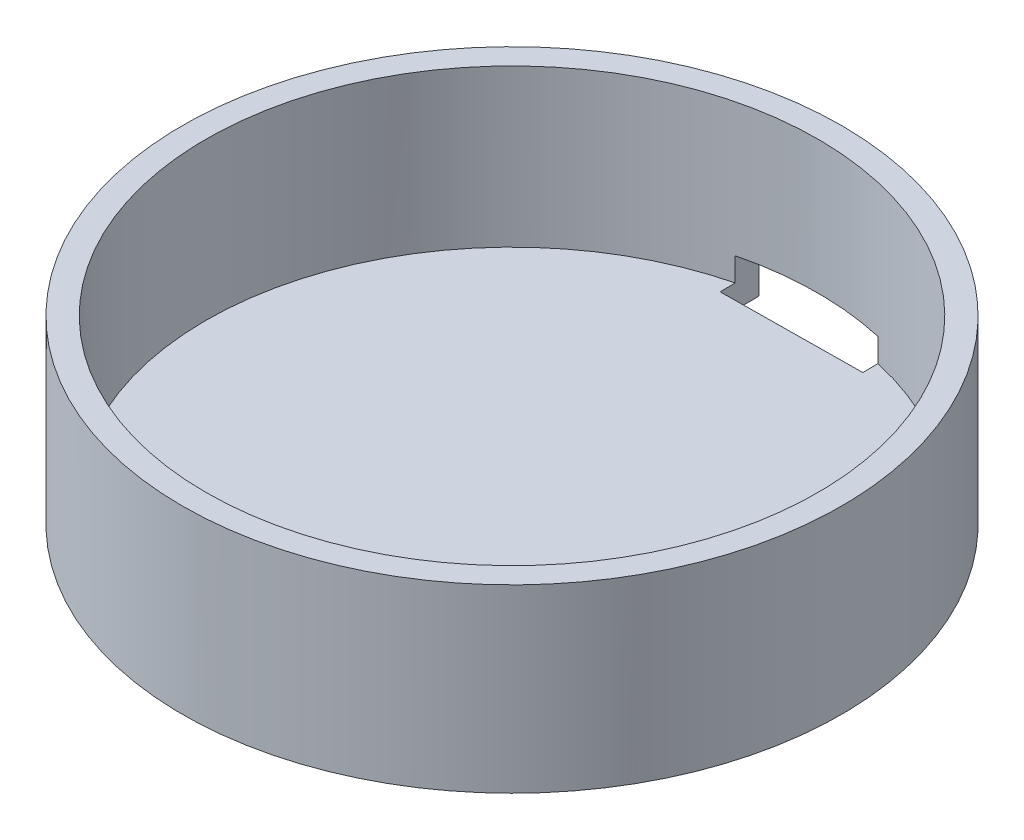
ISO-10303-21;
HEADER;
FILE_DESCRIPTION(('STEP AP214'),'2;1');
FILE_NAME('part.step','',(''),(''),'','','');
FILE_SCHEMA(('AUTOMOTIVE_DESIGN { 1 0 10303 214 1 1 1 1 }'));
ENDSEC;
DATA;
#1=APPLICATION_CONTEXT('core data for automotive mechanical design processes');
#2=APPLICATION_PROTOCOL_DEFINITION('international standard','automotive_design',2000,#1);
#3=PRODUCT_CONTEXT('',#1,'mechanical');
#4=PRODUCT('Part','Part','',(#3));
#5=PRODUCT_RELATED_PRODUCT_CATEGORY('part','',(#4));
#6=PRODUCT_DEFINITION_FORMATION('','',#4);
#7=PRODUCT_DEFINITION_CONTEXT('part definition',#1,'design');
#8=PRODUCT_DEFINITION('design','',#6,#7);
#9=PRODUCT_DEFINITION_SHAPE('','',#8);
#10=(LENGTH_UNIT() NAMED_UNIT(*) SI_UNIT(.MILLI.,.METRE.));
#11=(NAMED_UNIT(*) PLANE_ANGLE_UNIT() SI_UNIT($,.RADIAN.));
#12=(NAMED_UNIT(*) SI_UNIT($,.STERADIAN.) SOLID_ANGLE_UNIT());
#13=UNCERTAINTY_MEASURE_WITH_UNIT(LENGTH_MEASURE(1.E-05),#10,'distance_accuracy_value','');
#14=(GEOMETRIC_REPRESENTATION_CONTEXT(3) GLOBAL_UNCERTAINTY_ASSIGNED_CONTEXT((#13)) GLOBAL_UNIT_ASSIGNED_CONTEXT((#10,
#11,#12)) REPRESENTATION_CONTEXT('',''));
#15=CARTESIAN_POINT('',(0.,0.,0.));
#16=DIRECTION('',(0.,0.,1.));
#17=DIRECTION('',(1.,0.,0.));
#18=AXIS2_PLACEMENT_3D('',#15,#16,#17);
#19=CARTESIAN_POINT('',(0.,10.,0.));
#20=DIRECTION('',(0.,-1.,0.));
#21=DIRECTION('',(0.,0.,-1.));
#22=AXIS2_PLACEMENT_3D('',#19,#20,#21);
#23=CYLINDRICAL_SURFACE('',#22,21.);
#24=CARTESIAN_POINT('',(0.,10.,0.));
#25=DIRECTION('',(0.,1.,0.));
#26=DIRECTION('',(0.,0.,1.));
#27=AXIS2_PLACEMENT_3D('',#24,#25,#26);
#28=CIRCLE('',#27,21.);
#29=CARTESIAN_POINT('',(0.,10.,21.));
#30=VERTEX_POINT('',#29);
#31=EDGE_CURVE('E134',#30,#30,#28,.T.);
#32=ORIENTED_EDGE('',*,*,#31,.F.);
#33=EDGE_LOOP('',(#32));
#34=FACE_BOUND('',#33,.T.);
#35=CARTESIAN_POINT('',(0.,-1.5,0.));
#36=DIRECTION('',(0.,1.,0.));
#37=DIRECTION('',(0.,0.,1.));
#38=AXIS2_PLACEMENT_3D('',#35,#36,#37);
#39=CIRCLE('',#38,21.);
#40=CARTESIAN_POINT('',(-4.71799103544217,-1.5,-20.4631512868739));
#41=VERTEX_POINT('',#40);
#42=CARTESIAN_POINT('',(4.28149952543826,-1.5,-20.5589095482633));
#43=VERTEX_POINT('',#42);
#44=EDGE_CURVE('E109',#41,#43,#39,.T.);
#45=ORIENTED_EDGE('',*,*,#44,.T.);
#46=DIRECTION('',(0.,-1.,0.));
#47=VECTOR('',#46,1.);
#48=CARTESIAN_POINT('',(4.28149952543825,10.,-20.5589095482633));
#49=LINE('',#48,#47);
#50=CARTESIAN_POINT('',(4.28149952543825,1.5,-20.5589095482633));
#51=VERTEX_POINT('',#50);
#52=EDGE_CURVE('E118',#43,#51,#49,.F.);
#53=ORIENTED_EDGE('',*,*,#52,.T.);
#54=CARTESIAN_POINT('',(0.,1.5,0.));
#55=DIRECTION('',(0.,1.,0.));
#56=DIRECTION('',(0.,0.,1.));
#57=AXIS2_PLACEMENT_3D('',#54,#55,#56);
#58=CIRCLE('',#57,21.);
#59=CARTESIAN_POINT('',(-4.71799103544216,1.5,-20.4631512868739));
#60=VERTEX_POINT('',#59);
#61=EDGE_CURVE('E116',#51,#60,#58,.T.);
#62=ORIENTED_EDGE('',*,*,#61,.T.);
#63=DIRECTION('',(0.,-1.,0.));
#64=VECTOR('',#63,1.);
#65=CARTESIAN_POINT('',(-4.71799103544217,10.,-20.4631512868739));
#66=LINE('',#65,#64);
#67=EDGE_CURVE('E111',#60,#41,#66,.T.);
#68=ORIENTED_EDGE('',*,*,#67,.T.);
#69=EDGE_LOOP('',(#45,#53,#62,#68));
#70=FACE_BOUND('',#69,.T.);
#71=ADVANCED_FACE('F38',(#34,#70),#23,.T.);
#72=CARTESIAN_POINT('',(0.,10.,0.));
#73=DIRECTION('',(0.,1.,0.));
#74=DIRECTION('',(0.,0.,1.));
#75=AXIS2_PLACEMENT_3D('',#72,#73,#74);
#76=PLANE('',#75);
#77=CARTESIAN_POINT('',(0.,10.,0.));
#78=DIRECTION('',(0.,1.,0.));
#79=DIRECTION('',(0.,0.,1.));
#80=AXIS2_PLACEMENT_3D('',#77,#78,#79);
#81=CIRCLE('',#80,19.5);
#82=CARTESIAN_POINT('',(0.,10.,19.5));
#83=VERTEX_POINT('',#82);
#84=EDGE_CURVE('E125',#83,#83,#81,.T.);
#85=ORIENTED_EDGE('',*,*,#84,.F.);
#86=EDGE_LOOP('',(#85));
#87=FACE_BOUND('',#86,.T.);
#88=ORIENTED_EDGE('',*,*,#31,.T.);
#89=EDGE_LOOP('',(#88));
#90=FACE_BOUND('',#89,.T.);
#91=ADVANCED_FACE('F173',(#87,#90),#76,.T.);
#92=CARTESIAN_POINT('',(0.,-1.5,0.));
#93=DIRECTION('',(0.,1.,0.));
#94=DIRECTION('',(0.,0.,1.));
#95=AXIS2_PLACEMENT_3D('',#92,#93,#94);
#96=PLANE('',#95);
#97=ORIENTED_EDGE('',*,*,#44,.F.);
#98=DIRECTION('',(0.0106398068210493,0.,0.99994339565338));
#99=VECTOR('',#98,1.);
#100=CARTESIAN_POINT('',(-4.49974528044021,-1.5,0.0478791306947219));
#101=LINE('',#100,#99);
#102=CARTESIAN_POINT('',(-4.69126180321909,-1.5,-17.9511019910661));
#103=VERTEX_POINT('',#102);
#104=EDGE_CURVE('E101',#41,#103,#101,.T.);
#105=ORIENTED_EDGE('',*,*,#104,.T.);
#106=DIRECTION('',(-0.99994339565338,0.,0.0106398068210492));
#107=VECTOR('',#106,1.);
#108=CARTESIAN_POINT('',(-0.191516522778885,-1.5,-17.9989811217608));
#109=LINE('',#108,#107);
#110=CARTESIAN_POINT('',(4.30822875766133,-1.5,-18.0468602524556));
#111=VERTEX_POINT('',#110);
#112=EDGE_CURVE('E88',#111,#103,#109,.T.);
#113=ORIENTED_EDGE('',*,*,#112,.F.);
#114=DIRECTION('',(-0.0106398068210493,0.,-0.99994339565338));
#115=VECTOR('',#114,1.);
#116=CARTESIAN_POINT('',(4.49974528044021,-1.5,-0.047879130694722));
#117=LINE('',#116,#115);
#118=EDGE_CURVE('E158',#111,#43,#117,.T.);
#119=ORIENTED_EDGE('',*,*,#118,.T.);
#120=EDGE_LOOP('',(#97,#105,#113,#119));
#121=FACE_BOUND('',#120,.T.);
#122=ADVANCED_FACE('F40',(#121),#96,.F.);
#123=CARTESIAN_POINT('',(0.,10.,0.));
#124=DIRECTION('',(0.,-1.,0.));
#125=DIRECTION('',(0.,0.,-1.));
#126=AXIS2_PLACEMENT_3D('',#123,#124,#125);
#127=CYLINDRICAL_SURFACE('',#126,19.5);
#128=DIRECTION('',(0.,-1.,0.));
#129=VECTOR('',#128,1.);
#130=CARTESIAN_POINT('',(-4.70162142095247,10.,-18.9247128383508));
#131=LINE('',#130,#129);
#132=CARTESIAN_POINT('',(-4.70162142095247,1.5,-18.9247128383508));
#133=VERTEX_POINT('',#132);
#134=CARTESIAN_POINT('',(-4.70162142095248,0.,-18.9247128383508));
#135=VERTEX_POINT('',#134);
#136=EDGE_CURVE('E112',#133,#135,#131,.T.);
#137=ORIENTED_EDGE('',*,*,#136,.F.);
#138=CARTESIAN_POINT('',(0.,1.5,0.));
#139=DIRECTION('',(0.,1.,0.));
#140=DIRECTION('',(0.,0.,1.));
#141=AXIS2_PLACEMENT_3D('',#138,#139,#140);
#142=CIRCLE('',#141,19.5);
#143=CARTESIAN_POINT('',(4.29786913992794,1.5,-19.0204710997403));
#144=VERTEX_POINT('',#143);
#145=EDGE_CURVE('E11',#144,#133,#142,.T.);
#146=ORIENTED_EDGE('',*,*,#145,.F.);
#147=DIRECTION('',(0.,-1.,0.));
#148=VECTOR('',#147,1.);
#149=CARTESIAN_POINT('',(4.29786913992795,10.,-19.0204710997403));
#150=LINE('',#149,#148);
#151=CARTESIAN_POINT('',(4.29786913992795,0.,-19.0204710997403));
#152=VERTEX_POINT('',#151);
#153=EDGE_CURVE('E94',#152,#144,#150,.F.);
#154=ORIENTED_EDGE('',*,*,#153,.F.);
#155=CARTESIAN_POINT('',(0.,0.,0.));
#156=DIRECTION('',(0.,1.,0.));
#157=DIRECTION('',(0.,0.,1.));
#158=AXIS2_PLACEMENT_3D('',#155,#156,#157);
#159=CIRCLE('',#158,19.5);
#160=EDGE_CURVE('E124',#135,#152,#159,.T.);
#161=ORIENTED_EDGE('',*,*,#160,.F.);
#162=EDGE_LOOP('',(#137,#146,#154,#161));
#163=FACE_BOUND('',#162,.T.);
#164=ORIENTED_EDGE('',*,*,#84,.T.);
#165=EDGE_LOOP('',(#164));
#166=FACE_BOUND('',#165,.T.);
#167=ADVANCED_FACE('F155',(#163,#166),#127,.F.);
#168=CARTESIAN_POINT('',(0.,0.,0.));
#169=DIRECTION('',(0.,1.,0.));
#170=DIRECTION('',(0.,0.,1.));
#171=AXIS2_PLACEMENT_3D('',#168,#169,#170);
#172=PLANE('',#171);
#173=DIRECTION('',(0.0106398068210493,0.,0.99994339565338));
#174=VECTOR('',#173,1.);
#175=CARTESIAN_POINT('',(-4.49974528044021,0.,0.0478791306947219));
#176=LINE('',#175,#174);
#177=CARTESIAN_POINT('',(-4.69126180321909,0.,-17.9511019910661));
#178=VERTEX_POINT('',#177);
#179=EDGE_CURVE('E47',#135,#178,#176,.T.);
#180=ORIENTED_EDGE('',*,*,#179,.F.);
#181=ORIENTED_EDGE('',*,*,#160,.T.);
#182=DIRECTION('',(-0.0106398068210493,0.,-0.99994339565338));
#183=VECTOR('',#182,1.);
#184=CARTESIAN_POINT('',(4.49974528044021,0.,-0.047879130694722));
#185=LINE('',#184,#183);
#186=CARTESIAN_POINT('',(4.30822875766133,0.,-18.0468602524556));
#187=VERTEX_POINT('',#186);
#188=EDGE_CURVE('E141',#187,#152,#185,.T.);
#189=ORIENTED_EDGE('',*,*,#188,.F.);
#190=DIRECTION('',(-0.99994339565338,0.,0.0106398068210492));
#191=VECTOR('',#190,1.);
#192=CARTESIAN_POINT('',(-0.191516522778885,0.,-17.9989811217608));
#193=LINE('',#192,#191);
#194=EDGE_CURVE('E138',#187,#178,#193,.T.);
#195=ORIENTED_EDGE('',*,*,#194,.T.);
#196=EDGE_LOOP('',(#180,#181,#189,#195));
#197=FACE_BOUND('',#196,.T.);
#198=ADVANCED_FACE('F160',(#197),#172,.T.);
#199=CARTESIAN_POINT('',(4.30822875766133,1.5,-18.0468602524556));
#200=DIRECTION('',(0.,1.,0.));
#201=DIRECTION('',(0.,0.,1.));
#202=AXIS2_PLACEMENT_3D('',#199,#200,#201);
#203=PLANE('',#202);
#204=DIRECTION('',(-0.0106398068210493,0.,-0.999943395653379));
#205=VECTOR('',#204,1.);
#206=CARTESIAN_POINT('',(4.30822875766133,1.5,-18.0468602524556));
#207=LINE('',#206,#205);
#208=EDGE_CURVE('E95',#144,#51,#207,.T.);
#209=ORIENTED_EDGE('',*,*,#208,.F.);
#210=ORIENTED_EDGE('',*,*,#145,.T.);
#211=DIRECTION('',(-0.0106398068210493,0.,-0.999943395653379));
#212=VECTOR('',#211,1.);
#213=CARTESIAN_POINT('',(-4.69126180321909,1.5,-17.9511019910661));
#214=LINE('',#213,#212);
#215=EDGE_CURVE('E184',#133,#60,#214,.T.);
#216=ORIENTED_EDGE('',*,*,#215,.T.);
#217=ORIENTED_EDGE('',*,*,#61,.F.);
#218=EDGE_LOOP('',(#209,#210,#216,#217));
#219=FACE_BOUND('',#218,.T.);
#220=ADVANCED_FACE('F162',(#219),#203,.F.);
#221=CARTESIAN_POINT('',(-4.69126180321909,1.5,-17.9511019910661));
#222=DIRECTION('',(-0.999943395653379,0.,0.0106398068210493));
#223=DIRECTION('',(0.0106398068210493,0.,0.99994339565338));
#224=AXIS2_PLACEMENT_3D('',#221,#222,#223);
#225=PLANE('',#224);
#226=ORIENTED_EDGE('',*,*,#215,.F.);
#227=ORIENTED_EDGE('',*,*,#136,.T.);
#228=ORIENTED_EDGE('',*,*,#179,.T.);
#229=DIRECTION('',(0.,1.,0.));
#230=VECTOR('',#229,1.);
#231=CARTESIAN_POINT('',(-4.69126180321909,1.5,-17.9511019910661));
#232=LINE('',#231,#230);
#233=EDGE_CURVE('E59',#103,#178,#232,.T.);
#234=ORIENTED_EDGE('',*,*,#233,.F.);
#235=ORIENTED_EDGE('',*,*,#104,.F.);
#236=ORIENTED_EDGE('',*,*,#67,.F.);
#237=EDGE_LOOP('',(#226,#227,#228,#234,#235,#236));
#238=FACE_BOUND('',#237,.T.);
#239=ADVANCED_FACE('F99',(#238),#225,.F.);
#240=CARTESIAN_POINT('',(4.30822875766133,1.5,-18.0468602524556));
#241=DIRECTION('',(0.999943395653379,0.,-0.0106398068210493));
#242=DIRECTION('',(-0.0106398068210493,0.,-0.99994339565338));
#243=AXIS2_PLACEMENT_3D('',#240,#241,#242);
#244=PLANE('',#243);
#245=ORIENTED_EDGE('',*,*,#118,.F.);
#246=DIRECTION('',(0.,-1.,0.));
#247=VECTOR('',#246,1.);
#248=CARTESIAN_POINT('',(4.30822875766133,1.5,-18.0468602524556));
#249=LINE('',#248,#247);
#250=EDGE_CURVE('E54',#187,#111,#249,.T.);
#251=ORIENTED_EDGE('',*,*,#250,.F.);
#252=ORIENTED_EDGE('',*,*,#188,.T.);
#253=ORIENTED_EDGE('',*,*,#153,.T.);
#254=ORIENTED_EDGE('',*,*,#208,.T.);
#255=ORIENTED_EDGE('',*,*,#52,.F.);
#256=EDGE_LOOP('',(#245,#251,#252,#253,#254,#255));
#257=FACE_BOUND('',#256,.T.);
#258=ADVANCED_FACE('F147',(#257),#244,.F.);
#259=CARTESIAN_POINT('',(-0.191516522778885,0.,-17.9989811217608));
#260=DIRECTION('',(-0.0106398068210492,0.,-0.99994339565338));
#261=DIRECTION('',(-0.99994339565338,0.,0.0106398068210492));
#262=AXIS2_PLACEMENT_3D('',#259,#260,#261);
#263=PLANE('',#262);
#264=ORIENTED_EDGE('',*,*,#112,.T.);
#265=ORIENTED_EDGE('',*,*,#233,.T.);
#266=ORIENTED_EDGE('',*,*,#194,.F.);
#267=ORIENTED_EDGE('',*,*,#250,.T.);
#268=EDGE_LOOP('',(#264,#265,#266,#267));
#269=FACE_BOUND('',#268,.T.);
#270=ADVANCED_FACE('F89',(#269),#263,.T.);
#271=CLOSED_SHELL('',(#71,#91,#122,#167,#198,#220,#239,#258,#270));
#272=MANIFOLD_SOLID_BREP('B2',#271);
#273=ADVANCED_BREP_SHAPE_REPRESENTATION('',(#18,#272),#14);
#274=SHAPE_DEFINITION_REPRESENTATION(#9,#273);
ENDSEC;
END-ISO-10303-21;
